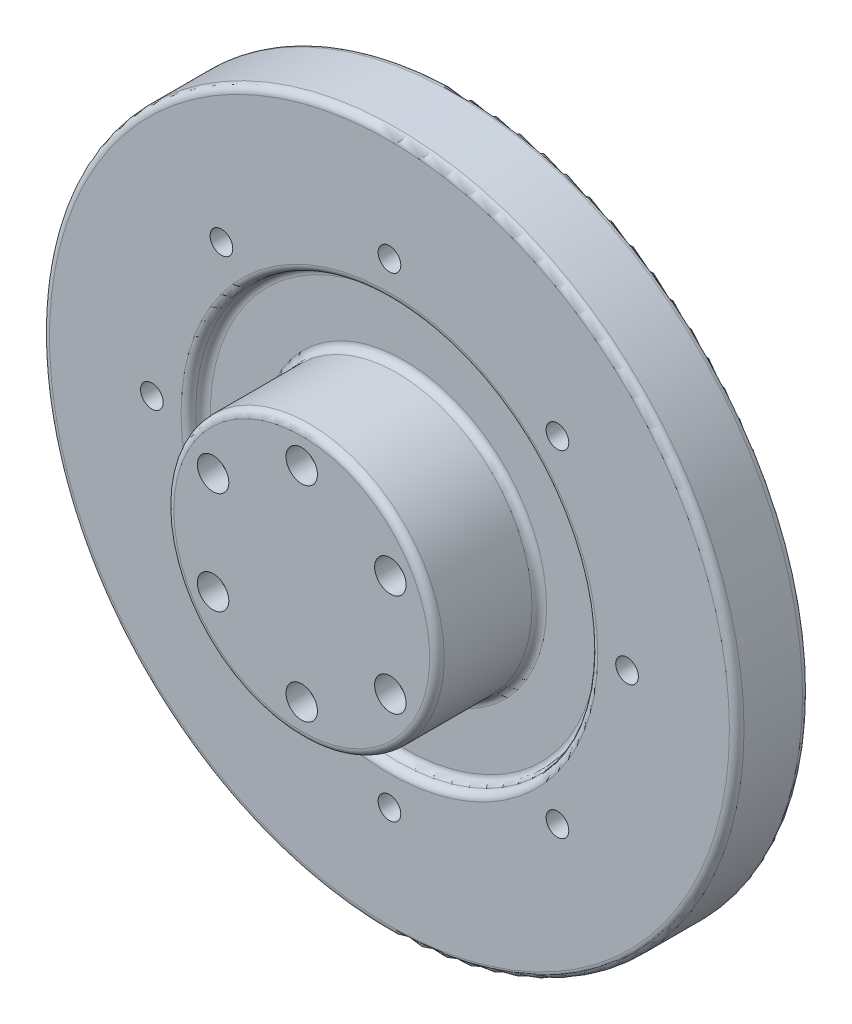
ISO-10303-21;
HEADER;
FILE_DESCRIPTION(('STEP AP214'),'2;1');
FILE_NAME('part.step','',(''),(''),'','','');
FILE_SCHEMA(('AUTOMOTIVE_DESIGN { 1 0 10303 214 1 1 1 1 }'));
ENDSEC;
DATA;
#1=APPLICATION_CONTEXT('core data for automotive mechanical design processes');
#2=APPLICATION_PROTOCOL_DEFINITION('international standard','automotive_design',2000,#1);
#3=PRODUCT_CONTEXT('',#1,'mechanical');
#4=PRODUCT('Part','Part','',(#3));
#5=PRODUCT_RELATED_PRODUCT_CATEGORY('part','',(#4));
#6=PRODUCT_DEFINITION_FORMATION('','',#4);
#7=PRODUCT_DEFINITION_CONTEXT('part definition',#1,'design');
#8=PRODUCT_DEFINITION('design','',#6,#7);
#9=PRODUCT_DEFINITION_SHAPE('','',#8);
#10=(LENGTH_UNIT() NAMED_UNIT(*) SI_UNIT(.MILLI.,.METRE.));
#11=(NAMED_UNIT(*) PLANE_ANGLE_UNIT() SI_UNIT($,.RADIAN.));
#12=(NAMED_UNIT(*) SI_UNIT($,.STERADIAN.) SOLID_ANGLE_UNIT());
#13=UNCERTAINTY_MEASURE_WITH_UNIT(LENGTH_MEASURE(1.E-05),#10,'distance_accuracy_value','');
#14=(GEOMETRIC_REPRESENTATION_CONTEXT(3) GLOBAL_UNCERTAINTY_ASSIGNED_CONTEXT((#13)) GLOBAL_UNIT_ASSIGNED_CONTEXT((#10,
#11,#12)) REPRESENTATION_CONTEXT('',''));
#15=CARTESIAN_POINT('',(0.,0.,0.));
#16=DIRECTION('',(0.,0.,1.));
#17=DIRECTION('',(1.,0.,0.));
#18=AXIS2_PLACEMENT_3D('',#15,#16,#17);
#19=CARTESIAN_POINT('',(0.,0.,10.));
#20=DIRECTION('',(0.,0.,-1.));
#21=DIRECTION('',(-1.,0.,0.));
#22=AXIS2_PLACEMENT_3D('',#19,#20,#21);
#23=CYLINDRICAL_SURFACE('',#22,47.5);
#24=CARTESIAN_POINT('',(0.,0.,0.999999999999999));
#25=DIRECTION('',(0.,0.,1.));
#26=DIRECTION('',(1.,0.,0.));
#27=AXIS2_PLACEMENT_3D('',#24,#25,#26);
#28=CIRCLE('',#27,47.5);
#29=CARTESIAN_POINT('',(47.5,0.,0.999999999999999));
#30=VERTEX_POINT('',#29);
#31=EDGE_CURVE('E66',#30,#30,#28,.T.);
#32=ORIENTED_EDGE('',*,*,#31,.T.);
#33=EDGE_LOOP('',(#32));
#34=FACE_BOUND('',#33,.T.);
#35=CARTESIAN_POINT('',(0.,0.,9.));
#36=DIRECTION('',(0.,0.,1.));
#37=DIRECTION('',(1.,0.,0.));
#38=AXIS2_PLACEMENT_3D('',#35,#36,#37);
#39=CIRCLE('',#38,47.5);
#40=CARTESIAN_POINT('',(47.5,0.,9.));
#41=VERTEX_POINT('',#40);
#42=EDGE_CURVE('E69',#41,#41,#39,.F.);
#43=ORIENTED_EDGE('',*,*,#42,.T.);
#44=EDGE_LOOP('',(#43));
#45=FACE_BOUND('',#44,.T.);
#46=ADVANCED_FACE('F39',(#34,#45),#23,.T.);
#47=CARTESIAN_POINT('',(0.,0.,10.));
#48=DIRECTION('',(0.,0.,1.));
#49=DIRECTION('',(1.,0.,0.));
#50=AXIS2_PLACEMENT_3D('',#47,#48,#49);
#51=PLANE('',#50);
#52=CARTESIAN_POINT('',(0.,0.,10.));
#53=DIRECTION('',(0.,0.,1.));
#54=DIRECTION('',(1.,0.,0.));
#55=AXIS2_PLACEMENT_3D('',#52,#53,#54);
#56=CIRCLE('',#55,28.5);
#57=CARTESIAN_POINT('',(28.5,0.,10.));
#58=VERTEX_POINT('',#57);
#59=EDGE_CURVE('E87',#58,#58,#56,.F.);
#60=ORIENTED_EDGE('',*,*,#59,.T.);
#61=EDGE_LOOP('',(#60));
#62=FACE_BOUND('',#61,.T.);
#63=CARTESIAN_POINT('',(0.,0.,10.));
#64=DIRECTION('',(0.,0.,1.));
#65=DIRECTION('',(1.,0.,0.));
#66=AXIS2_PLACEMENT_3D('',#63,#64,#65);
#67=CIRCLE('',#66,46.5);
#68=CARTESIAN_POINT('',(46.5,0.,10.));
#69=VERTEX_POINT('',#68);
#70=EDGE_CURVE('E90',#69,#69,#67,.T.);
#71=ORIENTED_EDGE('',*,*,#70,.T.);
#72=EDGE_LOOP('',(#71));
#73=FACE_BOUND('',#72,.T.);
#74=CARTESIAN_POINT('',(-32.5,-1.13473143512402E-13,10.));
#75=DIRECTION('',(0.,0.,-1.));
#76=DIRECTION('',(0.,-1.,0.));
#77=AXIS2_PLACEMENT_3D('',#74,#75,#76);
#78=CIRCLE('',#77,1.55);
#79=CARTESIAN_POINT('',(-32.5,-1.55000000000011,10.));
#80=VERTEX_POINT('',#79);
#81=EDGE_CURVE('E161',#80,#80,#78,.T.);
#82=ORIENTED_EDGE('',*,*,#81,.T.);
#83=EDGE_LOOP('',(#82));
#84=FACE_BOUND('',#83,.T.);
#85=CARTESIAN_POINT('',(-22.9809703885627,-22.9809703885629,10.));
#86=DIRECTION('',(0.,0.,-1.));
#87=DIRECTION('',(0.707106781186551,-0.707106781186544,0.));
#88=AXIS2_PLACEMENT_3D('',#85,#86,#87);
#89=CIRCLE('',#88,1.55);
#90=CARTESIAN_POINT('',(-21.8849548777235,-24.0769858994021,10.));
#91=VERTEX_POINT('',#90);
#92=EDGE_CURVE('E155',#91,#91,#89,.T.);
#93=ORIENTED_EDGE('',*,*,#92,.T.);
#94=EDGE_LOOP('',(#93));
#95=FACE_BOUND('',#94,.T.);
#96=CARTESIAN_POINT('',(0.,-32.5,10.));
#97=DIRECTION('',(0.,0.,-1.));
#98=DIRECTION('',(1.,0.,0.));
#99=AXIS2_PLACEMENT_3D('',#96,#97,#98);
#100=CIRCLE('',#99,1.55);
#101=CARTESIAN_POINT('',(1.55,-32.5,10.));
#102=VERTEX_POINT('',#101);
#103=EDGE_CURVE('E149',#102,#102,#100,.T.);
#104=ORIENTED_EDGE('',*,*,#103,.T.);
#105=EDGE_LOOP('',(#104));
#106=FACE_BOUND('',#105,.T.);
#107=CARTESIAN_POINT('',(22.980970388563,-22.9809703885626,10.));
#108=DIRECTION('',(0.,0.,-1.));
#109=DIRECTION('',(0.707106781186541,0.707106781186554,0.));
#110=AXIS2_PLACEMENT_3D('',#107,#108,#109);
#111=CIRCLE('',#110,1.55);
#112=CARTESIAN_POINT('',(24.0769858994021,-21.8849548777234,10.));
#113=VERTEX_POINT('',#112);
#114=EDGE_CURVE('E142',#113,#113,#111,.T.);
#115=ORIENTED_EDGE('',*,*,#114,.T.);
#116=EDGE_LOOP('',(#115));
#117=FACE_BOUND('',#116,.T.);
#118=CARTESIAN_POINT('',(32.5,3.40419430537206E-13,10.));
#119=DIRECTION('',(0.,0.,-1.));
#120=DIRECTION('',(0.,1.,0.));
#121=AXIS2_PLACEMENT_3D('',#118,#119,#120);
#122=CIRCLE('',#121,1.55);
#123=CARTESIAN_POINT('',(32.5,1.55000000000034,10.));
#124=VERTEX_POINT('',#123);
#125=EDGE_CURVE('E173',#124,#124,#122,.T.);
#126=ORIENTED_EDGE('',*,*,#125,.T.);
#127=EDGE_LOOP('',(#126));
#128=FACE_BOUND('',#127,.T.);
#129=CARTESIAN_POINT('',(22.9809703885625,22.9809703885631,10.));
#130=DIRECTION('',(0.,0.,-1.));
#131=DIRECTION('',(-0.707106781186556,0.707106781186539,0.));
#132=AXIS2_PLACEMENT_3D('',#129,#130,#131);
#133=CIRCLE('',#132,1.55);
#134=CARTESIAN_POINT('',(21.8849548777234,24.0769858994022,10.));
#135=VERTEX_POINT('',#134);
#136=EDGE_CURVE('E166',#135,#135,#133,.T.);
#137=ORIENTED_EDGE('',*,*,#136,.T.);
#138=EDGE_LOOP('',(#137));
#139=FACE_BOUND('',#138,.T.);
#140=CARTESIAN_POINT('',(-22.9809703885628,22.9809703885628,10.));
#141=DIRECTION('',(0.,0.,-1.));
#142=DIRECTION('',(-0.707106781186546,-0.707106781186549,0.));
#143=AXIS2_PLACEMENT_3D('',#140,#141,#142);
#144=CIRCLE('',#143,1.55);
#145=CARTESIAN_POINT('',(-24.076985899402,21.8849548777236,10.));
#146=VERTEX_POINT('',#145);
#147=EDGE_CURVE('E136',#146,#146,#144,.T.);
#148=ORIENTED_EDGE('',*,*,#147,.T.);
#149=EDGE_LOOP('',(#148));
#150=FACE_BOUND('',#149,.T.);
#151=CARTESIAN_POINT('',(0.,32.5,10.));
#152=DIRECTION('',(0.,0.,-1.));
#153=DIRECTION('',(-1.,0.,0.));
#154=AXIS2_PLACEMENT_3D('',#151,#152,#153);
#155=CIRCLE('',#154,1.55);
#156=CARTESIAN_POINT('',(-1.55,32.5,10.));
#157=VERTEX_POINT('',#156);
#158=EDGE_CURVE('E130',#157,#157,#155,.T.);
#159=ORIENTED_EDGE('',*,*,#158,.T.);
#160=EDGE_LOOP('',(#159));
#161=FACE_BOUND('',#160,.T.);
#162=ADVANCED_FACE('F226',(#62,#73,#84,#95,#106,#117,#128,#139,#150,#161),#51,.T.);
#163=CARTESIAN_POINT('',(0.,0.,0.));
#164=DIRECTION('',(0.,0.,1.));
#165=DIRECTION('',(1.,0.,0.));
#166=AXIS2_PLACEMENT_3D('',#163,#164,#165);
#167=PLANE('',#166);
#168=CARTESIAN_POINT('',(0.,0.,0.));
#169=DIRECTION('',(0.,0.,1.));
#170=DIRECTION('',(1.,0.,0.));
#171=AXIS2_PLACEMENT_3D('',#168,#169,#170);
#172=CIRCLE('',#171,18.5);
#173=CARTESIAN_POINT('',(18.5,0.,0.));
#174=VERTEX_POINT('',#173);
#175=EDGE_CURVE('E72',#174,#174,#172,.T.);
#176=ORIENTED_EDGE('',*,*,#175,.T.);
#177=EDGE_LOOP('',(#176));
#178=FACE_BOUND('',#177,.T.);
#179=CARTESIAN_POINT('',(0.,0.,0.));
#180=DIRECTION('',(0.,0.,1.));
#181=DIRECTION('',(1.,0.,0.));
#182=AXIS2_PLACEMENT_3D('',#179,#180,#181);
#183=CIRCLE('',#182,46.5);
#184=CARTESIAN_POINT('',(46.5,0.,0.));
#185=VERTEX_POINT('',#184);
#186=EDGE_CURVE('E75',#185,#185,#183,.F.);
#187=ORIENTED_EDGE('',*,*,#186,.T.);
#188=EDGE_LOOP('',(#187));
#189=FACE_BOUND('',#188,.T.);
#190=CARTESIAN_POINT('',(22.9496732002875,13.2500000000003,0.));
#191=DIRECTION('',(0.,0.,-1.));
#192=DIRECTION('',(-0.50000000000001,0.866025403784433,0.));
#193=AXIS2_PLACEMENT_3D('',#190,#191,#192);
#194=CIRCLE('',#193,2.975);
#195=CARTESIAN_POINT('',(21.4621732002874,15.826425576259,0.));
#196=VERTEX_POINT('',#195);
#197=EDGE_CURVE('E59',#196,#196,#194,.T.);
#198=ORIENTED_EDGE('',*,*,#197,.F.);
#199=EDGE_LOOP('',(#198));
#200=FACE_BOUND('',#199,.T.);
#201=CARTESIAN_POINT('',(22.9496732002877,-13.2499999999998,0.));
#202=DIRECTION('',(0.,0.,-1.));
#203=DIRECTION('',(0.499999999999992,0.866025403784443,0.));
#204=AXIS2_PLACEMENT_3D('',#201,#202,#203);
#205=CIRCLE('',#204,2.975);
#206=CARTESIAN_POINT('',(24.4371732002877,-10.6735744237411,0.));
#207=VERTEX_POINT('',#206);
#208=EDGE_CURVE('E195',#207,#207,#205,.T.);
#209=ORIENTED_EDGE('',*,*,#208,.F.);
#210=EDGE_LOOP('',(#209));
#211=FACE_BOUND('',#210,.T.);
#212=CARTESIAN_POINT('',(0.,-26.5,0.));
#213=DIRECTION('',(0.,0.,-1.));
#214=DIRECTION('',(1.,0.,0.));
#215=AXIS2_PLACEMENT_3D('',#212,#213,#214);
#216=CIRCLE('',#215,2.975);
#217=CARTESIAN_POINT('',(2.975,-26.5,0.));
#218=VERTEX_POINT('',#217);
#219=EDGE_CURVE('E201',#218,#218,#216,.T.);
#220=ORIENTED_EDGE('',*,*,#219,.F.);
#221=EDGE_LOOP('',(#220));
#222=FACE_BOUND('',#221,.T.);
#223=CARTESIAN_POINT('',(-22.9496732002876,-13.2500000000001,0.));
#224=DIRECTION('',(0.,0.,-1.));
#225=DIRECTION('',(0.500000000000004,-0.866025403784436,0.));
#226=AXIS2_PLACEMENT_3D('',#223,#224,#225);
#227=CIRCLE('',#226,2.975);
#228=CARTESIAN_POINT('',(-21.4621732002876,-15.8264255762588,0.));
#229=VERTEX_POINT('',#228);
#230=EDGE_CURVE('E207',#229,#229,#227,.T.);
#231=ORIENTED_EDGE('',*,*,#230,.F.);
#232=EDGE_LOOP('',(#231));
#233=FACE_BOUND('',#232,.T.);
#234=CARTESIAN_POINT('',(-22.9496732002877,13.2499999999999,0.));
#235=DIRECTION('',(0.,0.,-1.));
#236=DIRECTION('',(-0.499999999999998,-0.86602540378444,0.));
#237=AXIS2_PLACEMENT_3D('',#234,#235,#236);
#238=CIRCLE('',#237,2.975);
#239=CARTESIAN_POINT('',(-24.4371732002876,10.6735744237412,0.));
#240=VERTEX_POINT('',#239);
#241=EDGE_CURVE('E184',#240,#240,#238,.T.);
#242=ORIENTED_EDGE('',*,*,#241,.F.);
#243=EDGE_LOOP('',(#242));
#244=FACE_BOUND('',#243,.T.);
#245=CARTESIAN_POINT('',(0.,26.5,0.));
#246=DIRECTION('',(0.,0.,-1.));
#247=DIRECTION('',(-1.,0.,0.));
#248=AXIS2_PLACEMENT_3D('',#245,#246,#247);
#249=CIRCLE('',#248,2.975);
#250=CARTESIAN_POINT('',(-2.975,26.5,0.));
#251=VERTEX_POINT('',#250);
#252=EDGE_CURVE('E178',#251,#251,#249,.T.);
#253=ORIENTED_EDGE('',*,*,#252,.F.);
#254=EDGE_LOOP('',(#253));
#255=FACE_BOUND('',#254,.T.);
#256=ADVANCED_FACE('F222',(#178,#189,#200,#211,#222,#233,#244,#255),#167,.F.);
#257=CARTESIAN_POINT('',(0.,0.,22.));
#258=DIRECTION('',(0.,0.,-1.));
#259=DIRECTION('',(-1.,0.,0.));
#260=AXIS2_PLACEMENT_3D('',#257,#258,#259);
#261=PLANE('',#260);
#262=CARTESIAN_POINT('',(0.,0.,22.));
#263=DIRECTION('',(0.,0.,-1.));
#264=DIRECTION('',(-1.,0.,0.));
#265=AXIS2_PLACEMENT_3D('',#262,#263,#264);
#266=CIRCLE('',#265,17.5);
#267=CARTESIAN_POINT('',(-17.5,0.,22.));
#268=VERTEX_POINT('',#267);
#269=EDGE_CURVE('E50',#268,#268,#266,.F.);
#270=ORIENTED_EDGE('',*,*,#269,.T.);
#271=EDGE_LOOP('',(#270));
#272=FACE_BOUND('',#271,.T.);
#273=CARTESIAN_POINT('',(-12.1243556529821,7.00000000000014,22.));
#274=DIRECTION('',(0.,0.,-1.));
#275=DIRECTION('',(-1.,0.,0.));
#276=AXIS2_PLACEMENT_3D('',#273,#274,#275);
#277=CIRCLE('',#276,2.15);
#278=CARTESIAN_POINT('',(-14.2743556529821,7.00000000000014,22.));
#279=VERTEX_POINT('',#278);
#280=EDGE_CURVE('E99',#279,#279,#277,.T.);
#281=ORIENTED_EDGE('',*,*,#280,.T.);
#282=EDGE_LOOP('',(#281));
#283=FACE_BOUND('',#282,.T.);
#284=CARTESIAN_POINT('',(-12.1243556529822,-6.99999999999989,22.));
#285=DIRECTION('',(0.,0.,-1.));
#286=DIRECTION('',(-1.,0.,0.));
#287=AXIS2_PLACEMENT_3D('',#284,#285,#286);
#288=CIRCLE('',#287,2.15);
#289=CARTESIAN_POINT('',(-14.2743556529822,-6.99999999999989,22.));
#290=VERTEX_POINT('',#289);
#291=EDGE_CURVE('E102',#290,#290,#288,.T.);
#292=ORIENTED_EDGE('',*,*,#291,.T.);
#293=EDGE_LOOP('',(#292));
#294=FACE_BOUND('',#293,.T.);
#295=CARTESIAN_POINT('',(0.,-14.,22.));
#296=DIRECTION('',(0.,0.,-1.));
#297=DIRECTION('',(-1.,0.,0.));
#298=AXIS2_PLACEMENT_3D('',#295,#296,#297);
#299=CIRCLE('',#298,2.15);
#300=CARTESIAN_POINT('',(-2.15,-14.,22.));
#301=VERTEX_POINT('',#300);
#302=EDGE_CURVE('E105',#301,#301,#299,.T.);
#303=ORIENTED_EDGE('',*,*,#302,.T.);
#304=EDGE_LOOP('',(#303));
#305=FACE_BOUND('',#304,.T.);
#306=CARTESIAN_POINT('',(12.1243556529821,-7.00000000000006,22.));
#307=DIRECTION('',(0.,0.,-1.));
#308=DIRECTION('',(-1.,0.,0.));
#309=AXIS2_PLACEMENT_3D('',#306,#307,#308);
#310=CIRCLE('',#309,2.15);
#311=CARTESIAN_POINT('',(9.97435565298211,-7.00000000000006,22.));
#312=VERTEX_POINT('',#311);
#313=EDGE_CURVE('E108',#312,#312,#310,.T.);
#314=ORIENTED_EDGE('',*,*,#313,.T.);
#315=EDGE_LOOP('',(#314));
#316=FACE_BOUND('',#315,.T.);
#317=CARTESIAN_POINT('',(12.1243556529822,6.99999999999997,22.));
#318=DIRECTION('',(0.,0.,-1.));
#319=DIRECTION('',(-1.,0.,0.));
#320=AXIS2_PLACEMENT_3D('',#317,#318,#319);
#321=CIRCLE('',#320,2.15);
#322=CARTESIAN_POINT('',(9.97435565298216,6.99999999999997,22.));
#323=VERTEX_POINT('',#322);
#324=EDGE_CURVE('E111',#323,#323,#321,.T.);
#325=ORIENTED_EDGE('',*,*,#324,.T.);
#326=EDGE_LOOP('',(#325));
#327=FACE_BOUND('',#326,.T.);
#328=CARTESIAN_POINT('',(0.,14.,22.));
#329=DIRECTION('',(0.,0.,-1.));
#330=DIRECTION('',(-1.,0.,0.));
#331=AXIS2_PLACEMENT_3D('',#328,#329,#330);
#332=CIRCLE('',#331,2.15);
#333=CARTESIAN_POINT('',(-2.15,14.,22.));
#334=VERTEX_POINT('',#333);
#335=EDGE_CURVE('E93',#334,#334,#332,.T.);
#336=ORIENTED_EDGE('',*,*,#335,.T.);
#337=EDGE_LOOP('',(#336));
#338=FACE_BOUND('',#337,.T.);
#339=ADVANCED_FACE('F225',(#272,#283,#294,#305,#316,#327,#338),#261,.F.);
#340=CARTESIAN_POINT('',(0.,0.,0.));
#341=DIRECTION('',(0.,0.,-1.));
#342=DIRECTION('',(-1.,0.,0.));
#343=AXIS2_PLACEMENT_3D('',#340,#341,#342);
#344=CYLINDRICAL_SURFACE('',#343,18.5);
#345=CARTESIAN_POINT('',(0.,0.,9.));
#346=DIRECTION('',(0.,0.,1.));
#347=DIRECTION('',(1.,0.,0.));
#348=AXIS2_PLACEMENT_3D('',#345,#346,#347);
#349=CIRCLE('',#348,18.5);
#350=CARTESIAN_POINT('',(18.5,0.,9.));
#351=VERTEX_POINT('',#350);
#352=EDGE_CURVE('E54',#351,#351,#349,.T.);
#353=ORIENTED_EDGE('',*,*,#352,.T.);
#354=EDGE_LOOP('',(#353));
#355=FACE_BOUND('',#354,.T.);
#356=CARTESIAN_POINT('',(0.,0.,21.));
#357=DIRECTION('',(0.,0.,-1.));
#358=DIRECTION('',(-1.,0.,0.));
#359=AXIS2_PLACEMENT_3D('',#356,#357,#358);
#360=CIRCLE('',#359,18.5);
#361=CARTESIAN_POINT('',(-18.5,0.,21.));
#362=VERTEX_POINT('',#361);
#363=EDGE_CURVE('E63',#362,#362,#360,.T.);
#364=ORIENTED_EDGE('',*,*,#363,.T.);
#365=EDGE_LOOP('',(#364));
#366=FACE_BOUND('',#365,.T.);
#367=ADVANCED_FACE('F298',(#355,#366),#344,.T.);
#368=CARTESIAN_POINT('',(0.,0.,19.));
#369=DIRECTION('',(0.,0.,-1.));
#370=DIRECTION('',(-1.,0.,0.));
#371=AXIS2_PLACEMENT_3D('',#368,#369,#370);
#372=CYLINDRICAL_SURFACE('',#371,17.5);
#373=CARTESIAN_POINT('',(0.,0.,18.5));
#374=DIRECTION('',(0.,0.,-1.));
#375=DIRECTION('',(-1.,0.,0.));
#376=AXIS2_PLACEMENT_3D('',#373,#374,#375);
#377=CIRCLE('',#376,17.5);
#378=CARTESIAN_POINT('',(-17.5,0.,18.5));
#379=VERTEX_POINT('',#378);
#380=EDGE_CURVE('E10',#379,#379,#377,.F.);
#381=ORIENTED_EDGE('',*,*,#380,.T.);
#382=EDGE_LOOP('',(#381));
#383=FACE_BOUND('',#382,.T.);
#384=CARTESIAN_POINT('',(0.,0.,1.));
#385=DIRECTION('',(0.,0.,1.));
#386=DIRECTION('',(1.,0.,0.));
#387=AXIS2_PLACEMENT_3D('',#384,#385,#386);
#388=CIRCLE('',#387,17.5);
#389=CARTESIAN_POINT('',(17.5,0.,1.));
#390=VERTEX_POINT('',#389);
#391=EDGE_CURVE('E78',#390,#390,#388,.F.);
#392=ORIENTED_EDGE('',*,*,#391,.T.);
#393=EDGE_LOOP('',(#392));
#394=FACE_BOUND('',#393,.T.);
#395=ADVANCED_FACE('F300',(#383,#394),#372,.F.);
#396=CARTESIAN_POINT('',(0.,0.,19.));
#397=DIRECTION('',(0.,0.,-1.));
#398=DIRECTION('',(-1.,0.,0.));
#399=AXIS2_PLACEMENT_3D('',#396,#397,#398);
#400=PLANE('',#399);
#401=CARTESIAN_POINT('',(0.,0.,19.));
#402=DIRECTION('',(0.,0.,-1.));
#403=DIRECTION('',(-1.,0.,0.));
#404=AXIS2_PLACEMENT_3D('',#401,#402,#403);
#405=CIRCLE('',#404,17.);
#406=CARTESIAN_POINT('',(-17.,0.,19.));
#407=VERTEX_POINT('',#406);
#408=EDGE_CURVE('E46',#407,#407,#405,.T.);
#409=ORIENTED_EDGE('',*,*,#408,.T.);
#410=EDGE_LOOP('',(#409));
#411=FACE_BOUND('',#410,.T.);
#412=CARTESIAN_POINT('',(-12.1243556529821,7.00000000000014,19.));
#413=DIRECTION('',(0.,0.,-1.));
#414=DIRECTION('',(-0.50000000000001,-0.866025403784433,0.));
#415=AXIS2_PLACEMENT_3D('',#412,#413,#414);
#416=CIRCLE('',#415,2.15);
#417=CARTESIAN_POINT('',(-13.1993556529821,5.13804538186361,19.));
#418=VERTEX_POINT('',#417);
#419=EDGE_CURVE('E118',#418,#418,#416,.T.);
#420=ORIENTED_EDGE('',*,*,#419,.F.);
#421=EDGE_LOOP('',(#420));
#422=FACE_BOUND('',#421,.T.);
#423=CARTESIAN_POINT('',(-12.1243556529822,-6.99999999999989,19.));
#424=DIRECTION('',(0.,0.,-1.));
#425=DIRECTION('',(0.499999999999992,-0.866025403784443,0.));
#426=AXIS2_PLACEMENT_3D('',#423,#424,#425);
#427=CIRCLE('',#426,2.15);
#428=CARTESIAN_POINT('',(-11.0493556529822,-8.86195461813644,19.));
#429=VERTEX_POINT('',#428);
#430=EDGE_CURVE('E121',#429,#429,#427,.T.);
#431=ORIENTED_EDGE('',*,*,#430,.F.);
#432=EDGE_LOOP('',(#431));
#433=FACE_BOUND('',#432,.T.);
#434=CARTESIAN_POINT('',(0.,-14.,19.));
#435=DIRECTION('',(0.,0.,-1.));
#436=DIRECTION('',(1.,0.,0.));
#437=AXIS2_PLACEMENT_3D('',#434,#435,#436);
#438=CIRCLE('',#437,2.15);
#439=CARTESIAN_POINT('',(2.15,-14.,19.));
#440=VERTEX_POINT('',#439);
#441=EDGE_CURVE('E125',#440,#440,#438,.T.);
#442=ORIENTED_EDGE('',*,*,#441,.F.);
#443=EDGE_LOOP('',(#442));
#444=FACE_BOUND('',#443,.T.);
#445=CARTESIAN_POINT('',(12.1243556529821,-7.00000000000006,19.));
#446=DIRECTION('',(0.,0.,-1.));
#447=DIRECTION('',(0.500000000000004,0.866025403784436,0.));
#448=AXIS2_PLACEMENT_3D('',#445,#446,#447);
#449=CIRCLE('',#448,2.15);
#450=CARTESIAN_POINT('',(13.1993556529821,-5.13804538186352,19.));
#451=VERTEX_POINT('',#450);
#452=EDGE_CURVE('E117',#451,#451,#449,.T.);
#453=ORIENTED_EDGE('',*,*,#452,.F.);
#454=EDGE_LOOP('',(#453));
#455=FACE_BOUND('',#454,.T.);
#456=CARTESIAN_POINT('',(12.1243556529822,6.99999999999997,19.));
#457=DIRECTION('',(0.,0.,-1.));
#458=DIRECTION('',(-0.499999999999998,0.86602540378444,0.));
#459=AXIS2_PLACEMENT_3D('',#456,#457,#458);
#460=CIRCLE('',#459,2.15);
#461=CARTESIAN_POINT('',(11.0493556529822,8.86195461813652,19.));
#462=VERTEX_POINT('',#461);
#463=EDGE_CURVE('E114',#462,#462,#460,.T.);
#464=ORIENTED_EDGE('',*,*,#463,.F.);
#465=EDGE_LOOP('',(#464));
#466=FACE_BOUND('',#465,.T.);
#467=CARTESIAN_POINT('',(0.,14.,19.));
#468=DIRECTION('',(0.,0.,-1.));
#469=DIRECTION('',(-1.,0.,0.));
#470=AXIS2_PLACEMENT_3D('',#467,#468,#469);
#471=CIRCLE('',#470,2.15);
#472=CARTESIAN_POINT('',(-2.15,14.,19.));
#473=VERTEX_POINT('',#472);
#474=EDGE_CURVE('E96',#473,#473,#471,.T.);
#475=ORIENTED_EDGE('',*,*,#474,.F.);
#476=EDGE_LOOP('',(#475));
#477=FACE_BOUND('',#476,.T.);
#478=ADVANCED_FACE('F306',(#411,#422,#433,#444,#455,#466,#477),#400,.T.);
#479=CARTESIAN_POINT('',(0.,14.,29.));
#480=DIRECTION('',(0.,0.,-1.));
#481=DIRECTION('',(-1.,0.,0.));
#482=AXIS2_PLACEMENT_3D('',#479,#480,#481);
#483=CYLINDRICAL_SURFACE('',#482,2.15);
#484=ORIENTED_EDGE('',*,*,#474,.T.);
#485=EDGE_LOOP('',(#484));
#486=FACE_BOUND('',#485,.T.);
#487=ORIENTED_EDGE('',*,*,#335,.F.);
#488=EDGE_LOOP('',(#487));
#489=FACE_BOUND('',#488,.T.);
#490=ADVANCED_FACE('F313',(#486,#489),#483,.F.);
#491=CARTESIAN_POINT('',(12.1243556529822,6.99999999999997,29.));
#492=DIRECTION('',(0.,0.,-1.));
#493=DIRECTION('',(-1.,0.,0.));
#494=AXIS2_PLACEMENT_3D('',#491,#492,#493);
#495=CYLINDRICAL_SURFACE('',#494,2.15);
#496=ORIENTED_EDGE('',*,*,#463,.T.);
#497=EDGE_LOOP('',(#496));
#498=FACE_BOUND('',#497,.T.);
#499=ORIENTED_EDGE('',*,*,#324,.F.);
#500=EDGE_LOOP('',(#499));
#501=FACE_BOUND('',#500,.T.);
#502=ADVANCED_FACE('F316',(#498,#501),#495,.F.);
#503=CARTESIAN_POINT('',(12.1243556529821,-7.00000000000006,29.));
#504=DIRECTION('',(0.,0.,-1.));
#505=DIRECTION('',(-1.,0.,0.));
#506=AXIS2_PLACEMENT_3D('',#503,#504,#505);
#507=CYLINDRICAL_SURFACE('',#506,2.15);
#508=ORIENTED_EDGE('',*,*,#452,.T.);
#509=EDGE_LOOP('',(#508));
#510=FACE_BOUND('',#509,.T.);
#511=ORIENTED_EDGE('',*,*,#313,.F.);
#512=EDGE_LOOP('',(#511));
#513=FACE_BOUND('',#512,.T.);
#514=ADVANCED_FACE('F320',(#510,#513),#507,.F.);
#515=CARTESIAN_POINT('',(0.,-14.,29.));
#516=DIRECTION('',(0.,0.,-1.));
#517=DIRECTION('',(-1.,0.,0.));
#518=AXIS2_PLACEMENT_3D('',#515,#516,#517);
#519=CYLINDRICAL_SURFACE('',#518,2.15);
#520=ORIENTED_EDGE('',*,*,#441,.T.);
#521=EDGE_LOOP('',(#520));
#522=FACE_BOUND('',#521,.T.);
#523=ORIENTED_EDGE('',*,*,#302,.F.);
#524=EDGE_LOOP('',(#523));
#525=FACE_BOUND('',#524,.T.);
#526=ADVANCED_FACE('F330',(#522,#525),#519,.F.);
#527=CARTESIAN_POINT('',(-12.1243556529822,-6.99999999999989,29.));
#528=DIRECTION('',(0.,0.,-1.));
#529=DIRECTION('',(-1.,0.,0.));
#530=AXIS2_PLACEMENT_3D('',#527,#528,#529);
#531=CYLINDRICAL_SURFACE('',#530,2.15);
#532=ORIENTED_EDGE('',*,*,#430,.T.);
#533=EDGE_LOOP('',(#532));
#534=FACE_BOUND('',#533,.T.);
#535=ORIENTED_EDGE('',*,*,#291,.F.);
#536=EDGE_LOOP('',(#535));
#537=FACE_BOUND('',#536,.T.);
#538=ADVANCED_FACE('F326',(#534,#537),#531,.F.);
#539=CARTESIAN_POINT('',(-12.1243556529821,7.00000000000014,29.));
#540=DIRECTION('',(0.,0.,-1.));
#541=DIRECTION('',(-1.,0.,0.));
#542=AXIS2_PLACEMENT_3D('',#539,#540,#541);
#543=CYLINDRICAL_SURFACE('',#542,2.15);
#544=ORIENTED_EDGE('',*,*,#419,.T.);
#545=EDGE_LOOP('',(#544));
#546=FACE_BOUND('',#545,.T.);
#547=ORIENTED_EDGE('',*,*,#280,.F.);
#548=EDGE_LOOP('',(#547));
#549=FACE_BOUND('',#548,.T.);
#550=ADVANCED_FACE('F322',(#546,#549),#543,.F.);
#551=CARTESIAN_POINT('',(0.,32.5,5.3));
#552=DIRECTION('',(0.,0.,1.));
#553=DIRECTION('',(1.,0.,0.));
#554=AXIS2_PLACEMENT_3D('',#551,#552,#553);
#555=CYLINDRICAL_SURFACE('',#554,1.55);
#556=CARTESIAN_POINT('',(0.,32.5,5.3));
#557=DIRECTION('',(0.,0.,-1.));
#558=DIRECTION('',(-1.,0.,0.));
#559=AXIS2_PLACEMENT_3D('',#556,#557,#558);
#560=CIRCLE('',#559,1.55);
#561=CARTESIAN_POINT('',(-1.55,32.5,5.3));
#562=VERTEX_POINT('',#561);
#563=EDGE_CURVE('E122',#562,#562,#560,.T.);
#564=ORIENTED_EDGE('',*,*,#563,.T.);
#565=EDGE_LOOP('',(#564));
#566=FACE_BOUND('',#565,.T.);
#567=ORIENTED_EDGE('',*,*,#158,.F.);
#568=EDGE_LOOP('',(#567));
#569=FACE_BOUND('',#568,.T.);
#570=ADVANCED_FACE('F325',(#566,#569),#555,.F.);
#571=CARTESIAN_POINT('',(0.,32.5,5.3));
#572=DIRECTION('',(0.,0.,-1.));
#573=DIRECTION('',(-1.,0.,0.));
#574=AXIS2_PLACEMENT_3D('',#571,#572,#573);
#575=PLANE('',#574);
#576=ORIENTED_EDGE('',*,*,#563,.F.);
#577=EDGE_LOOP('',(#576));
#578=FACE_BOUND('',#577,.T.);
#579=ADVANCED_FACE('F340',(#578),#575,.F.);
#580=CARTESIAN_POINT('',(-22.9809703885628,22.9809703885628,5.3));
#581=DIRECTION('',(0.,0.,1.));
#582=DIRECTION('',(1.,0.,0.));
#583=AXIS2_PLACEMENT_3D('',#580,#581,#582);
#584=CYLINDRICAL_SURFACE('',#583,1.55);
#585=CARTESIAN_POINT('',(-22.9809703885628,22.9809703885628,5.3));
#586=DIRECTION('',(0.,0.,-1.));
#587=DIRECTION('',(-0.707106781186546,-0.707106781186549,0.));
#588=AXIS2_PLACEMENT_3D('',#585,#586,#587);
#589=CIRCLE('',#588,1.55);
#590=CARTESIAN_POINT('',(-24.076985899402,21.8849548777236,5.3));
#591=VERTEX_POINT('',#590);
#592=EDGE_CURVE('E133',#591,#591,#589,.T.);
#593=ORIENTED_EDGE('',*,*,#592,.T.);
#594=EDGE_LOOP('',(#593));
#595=FACE_BOUND('',#594,.T.);
#596=ORIENTED_EDGE('',*,*,#147,.F.);
#597=EDGE_LOOP('',(#596));
#598=FACE_BOUND('',#597,.T.);
#599=ADVANCED_FACE('F344',(#595,#598),#584,.F.);
#600=CARTESIAN_POINT('',(-22.9809703885628,22.9809703885628,5.3));
#601=DIRECTION('',(0.,0.,-1.));
#602=DIRECTION('',(-0.707106781186546,-0.707106781186549,0.));
#603=AXIS2_PLACEMENT_3D('',#600,#601,#602);
#604=PLANE('',#603);
#605=ORIENTED_EDGE('',*,*,#592,.F.);
#606=EDGE_LOOP('',(#605));
#607=FACE_BOUND('',#606,.T.);
#608=ADVANCED_FACE('F348',(#607),#604,.F.);
#609=CARTESIAN_POINT('',(22.9809703885625,22.9809703885631,5.3));
#610=DIRECTION('',(0.,0.,1.));
#611=DIRECTION('',(1.,0.,0.));
#612=AXIS2_PLACEMENT_3D('',#609,#610,#611);
#613=CYLINDRICAL_SURFACE('',#612,1.55);
#614=CARTESIAN_POINT('',(22.9809703885625,22.9809703885631,5.3));
#615=DIRECTION('',(0.,0.,-1.));
#616=DIRECTION('',(-0.707106781186556,0.707106781186539,0.));
#617=AXIS2_PLACEMENT_3D('',#614,#615,#616);
#618=CIRCLE('',#617,1.55);
#619=CARTESIAN_POINT('',(21.8849548777234,24.0769858994022,5.3));
#620=VERTEX_POINT('',#619);
#621=EDGE_CURVE('E169',#620,#620,#618,.T.);
#622=ORIENTED_EDGE('',*,*,#621,.T.);
#623=EDGE_LOOP('',(#622));
#624=FACE_BOUND('',#623,.T.);
#625=ORIENTED_EDGE('',*,*,#136,.F.);
#626=EDGE_LOOP('',(#625));
#627=FACE_BOUND('',#626,.T.);
#628=ADVANCED_FACE('F352',(#624,#627),#613,.F.);
#629=CARTESIAN_POINT('',(22.9809703885625,22.9809703885631,5.3));
#630=DIRECTION('',(0.,0.,-1.));
#631=DIRECTION('',(-0.707106781186556,0.707106781186539,0.));
#632=AXIS2_PLACEMENT_3D('',#629,#630,#631);
#633=PLANE('',#632);
#634=ORIENTED_EDGE('',*,*,#621,.F.);
#635=EDGE_LOOP('',(#634));
#636=FACE_BOUND('',#635,.T.);
#637=ADVANCED_FACE('F387',(#636),#633,.F.);
#638=CARTESIAN_POINT('',(32.5,3.40419430537206E-13,5.3));
#639=DIRECTION('',(0.,0.,1.));
#640=DIRECTION('',(1.,0.,0.));
#641=AXIS2_PLACEMENT_3D('',#638,#639,#640);
#642=CYLINDRICAL_SURFACE('',#641,1.55);
#643=CARTESIAN_POINT('',(32.5,3.40419430537206E-13,5.3));
#644=DIRECTION('',(0.,0.,-1.));
#645=DIRECTION('',(0.,1.,0.));
#646=AXIS2_PLACEMENT_3D('',#643,#644,#645);
#647=CIRCLE('',#646,1.55);
#648=CARTESIAN_POINT('',(32.5,1.55000000000034,5.3));
#649=VERTEX_POINT('',#648);
#650=EDGE_CURVE('E146',#649,#649,#647,.T.);
#651=ORIENTED_EDGE('',*,*,#650,.T.);
#652=EDGE_LOOP('',(#651));
#653=FACE_BOUND('',#652,.T.);
#654=ORIENTED_EDGE('',*,*,#125,.F.);
#655=EDGE_LOOP('',(#654));
#656=FACE_BOUND('',#655,.T.);
#657=ADVANCED_FACE('F391',(#653,#656),#642,.F.);
#658=CARTESIAN_POINT('',(32.5,3.40419430537206E-13,5.3));
#659=DIRECTION('',(0.,0.,-1.));
#660=DIRECTION('',(0.,1.,0.));
#661=AXIS2_PLACEMENT_3D('',#658,#659,#660);
#662=PLANE('',#661);
#663=ORIENTED_EDGE('',*,*,#650,.F.);
#664=EDGE_LOOP('',(#663));
#665=FACE_BOUND('',#664,.T.);
#666=ADVANCED_FACE('F358',(#665),#662,.F.);
#667=CARTESIAN_POINT('',(22.980970388563,-22.9809703885626,5.3));
#668=DIRECTION('',(0.,0.,1.));
#669=DIRECTION('',(1.,0.,0.));
#670=AXIS2_PLACEMENT_3D('',#667,#668,#669);
#671=CYLINDRICAL_SURFACE('',#670,1.55);
#672=CARTESIAN_POINT('',(22.980970388563,-22.9809703885626,5.3));
#673=DIRECTION('',(0.,0.,-1.));
#674=DIRECTION('',(0.707106781186541,0.707106781186554,0.));
#675=AXIS2_PLACEMENT_3D('',#672,#673,#674);
#676=CIRCLE('',#675,1.55);
#677=CARTESIAN_POINT('',(24.0769858994021,-21.8849548777234,5.3));
#678=VERTEX_POINT('',#677);
#679=EDGE_CURVE('E145',#678,#678,#676,.T.);
#680=ORIENTED_EDGE('',*,*,#679,.T.);
#681=EDGE_LOOP('',(#680));
#682=FACE_BOUND('',#681,.T.);
#683=ORIENTED_EDGE('',*,*,#114,.F.);
#684=EDGE_LOOP('',(#683));
#685=FACE_BOUND('',#684,.T.);
#686=ADVANCED_FACE('F354',(#682,#685),#671,.F.);
#687=CARTESIAN_POINT('',(22.980970388563,-22.9809703885626,5.3));
#688=DIRECTION('',(0.,0.,-1.));
#689=DIRECTION('',(0.707106781186541,0.707106781186554,0.));
#690=AXIS2_PLACEMENT_3D('',#687,#688,#689);
#691=PLANE('',#690);
#692=ORIENTED_EDGE('',*,*,#679,.F.);
#693=EDGE_LOOP('',(#692));
#694=FACE_BOUND('',#693,.T.);
#695=ADVANCED_FACE('F357',(#694),#691,.F.);
#696=CARTESIAN_POINT('',(0.,-32.5,5.3));
#697=DIRECTION('',(0.,0.,1.));
#698=DIRECTION('',(1.,0.,0.));
#699=AXIS2_PLACEMENT_3D('',#696,#697,#698);
#700=CYLINDRICAL_SURFACE('',#699,1.55);
#701=CARTESIAN_POINT('',(0.,-32.5,5.3));
#702=DIRECTION('',(0.,0.,-1.));
#703=DIRECTION('',(1.,0.,0.));
#704=AXIS2_PLACEMENT_3D('',#701,#702,#703);
#705=CIRCLE('',#704,1.55);
#706=CARTESIAN_POINT('',(1.55,-32.5,5.3));
#707=VERTEX_POINT('',#706);
#708=EDGE_CURVE('E152',#707,#707,#705,.T.);
#709=ORIENTED_EDGE('',*,*,#708,.T.);
#710=EDGE_LOOP('',(#709));
#711=FACE_BOUND('',#710,.T.);
#712=ORIENTED_EDGE('',*,*,#103,.F.);
#713=EDGE_LOOP('',(#712));
#714=FACE_BOUND('',#713,.T.);
#715=ADVANCED_FACE('F362',(#711,#714),#700,.F.);
#716=CARTESIAN_POINT('',(0.,-32.5,5.3));
#717=DIRECTION('',(0.,0.,-1.));
#718=DIRECTION('',(1.,0.,0.));
#719=AXIS2_PLACEMENT_3D('',#716,#717,#718);
#720=PLANE('',#719);
#721=ORIENTED_EDGE('',*,*,#708,.F.);
#722=EDGE_LOOP('',(#721));
#723=FACE_BOUND('',#722,.T.);
#724=ADVANCED_FACE('F366',(#723),#720,.F.);
#725=CARTESIAN_POINT('',(-22.9809703885627,-22.9809703885629,5.3));
#726=DIRECTION('',(0.,0.,1.));
#727=DIRECTION('',(1.,0.,0.));
#728=AXIS2_PLACEMENT_3D('',#725,#726,#727);
#729=CYLINDRICAL_SURFACE('',#728,1.55);
#730=CARTESIAN_POINT('',(-22.9809703885627,-22.9809703885629,5.3));
#731=DIRECTION('',(0.,0.,-1.));
#732=DIRECTION('',(0.707106781186551,-0.707106781186544,0.));
#733=AXIS2_PLACEMENT_3D('',#730,#731,#732);
#734=CIRCLE('',#733,1.55);
#735=CARTESIAN_POINT('',(-21.8849548777235,-24.0769858994021,5.3));
#736=VERTEX_POINT('',#735);
#737=EDGE_CURVE('E158',#736,#736,#734,.T.);
#738=ORIENTED_EDGE('',*,*,#737,.T.);
#739=EDGE_LOOP('',(#738));
#740=FACE_BOUND('',#739,.T.);
#741=ORIENTED_EDGE('',*,*,#92,.F.);
#742=EDGE_LOOP('',(#741));
#743=FACE_BOUND('',#742,.T.);
#744=ADVANCED_FACE('F370',(#740,#743),#729,.F.);
#745=CARTESIAN_POINT('',(-22.9809703885627,-22.9809703885629,5.3));
#746=DIRECTION('',(0.,0.,-1.));
#747=DIRECTION('',(0.707106781186551,-0.707106781186544,0.));
#748=AXIS2_PLACEMENT_3D('',#745,#746,#747);
#749=PLANE('',#748);
#750=ORIENTED_EDGE('',*,*,#737,.F.);
#751=EDGE_LOOP('',(#750));
#752=FACE_BOUND('',#751,.T.);
#753=ADVANCED_FACE('F374',(#752),#749,.F.);
#754=CARTESIAN_POINT('',(-32.5,-1.13473143512402E-13,5.3));
#755=DIRECTION('',(0.,0.,1.));
#756=DIRECTION('',(1.,0.,0.));
#757=AXIS2_PLACEMENT_3D('',#754,#755,#756);
#758=CYLINDRICAL_SURFACE('',#757,1.55);
#759=CARTESIAN_POINT('',(-32.5,-1.13473143512402E-13,5.3));
#760=DIRECTION('',(0.,0.,-1.));
#761=DIRECTION('',(0.,-1.,0.));
#762=AXIS2_PLACEMENT_3D('',#759,#760,#761);
#763=CIRCLE('',#762,1.55);
#764=CARTESIAN_POINT('',(-32.5,-1.55000000000011,5.3));
#765=VERTEX_POINT('',#764);
#766=EDGE_CURVE('E139',#765,#765,#763,.T.);
#767=ORIENTED_EDGE('',*,*,#766,.T.);
#768=EDGE_LOOP('',(#767));
#769=FACE_BOUND('',#768,.T.);
#770=ORIENTED_EDGE('',*,*,#81,.F.);
#771=EDGE_LOOP('',(#770));
#772=FACE_BOUND('',#771,.T.);
#773=ADVANCED_FACE('F378',(#769,#772),#758,.F.);
#774=CARTESIAN_POINT('',(-32.5,-1.13473143512402E-13,5.3));
#775=DIRECTION('',(0.,0.,-1.));
#776=DIRECTION('',(0.,-1.,0.));
#777=AXIS2_PLACEMENT_3D('',#774,#775,#776);
#778=PLANE('',#777);
#779=ORIENTED_EDGE('',*,*,#766,.F.);
#780=EDGE_LOOP('',(#779));
#781=FACE_BOUND('',#780,.T.);
#782=ADVANCED_FACE('F247',(#781),#778,.F.);
#783=CARTESIAN_POINT('',(0.,0.,8.));
#784=DIRECTION('',(0.,0.,1.));
#785=DIRECTION('',(1.,0.,0.));
#786=AXIS2_PLACEMENT_3D('',#783,#784,#785);
#787=PLANE('',#786);
#788=CARTESIAN_POINT('',(0.,0.,8.));
#789=DIRECTION('',(0.,0.,1.));
#790=DIRECTION('',(1.,0.,0.));
#791=AXIS2_PLACEMENT_3D('',#788,#789,#790);
#792=CIRCLE('',#791,26.5);
#793=CARTESIAN_POINT('',(26.5,0.,8.));
#794=VERTEX_POINT('',#793);
#795=EDGE_CURVE('E81',#794,#794,#792,.T.);
#796=ORIENTED_EDGE('',*,*,#795,.T.);
#797=EDGE_LOOP('',(#796));
#798=FACE_BOUND('',#797,.T.);
#799=CARTESIAN_POINT('',(0.,0.,8.));
#800=DIRECTION('',(0.,0.,1.));
#801=DIRECTION('',(1.,0.,0.));
#802=AXIS2_PLACEMENT_3D('',#799,#800,#801);
#803=CIRCLE('',#802,19.5);
#804=CARTESIAN_POINT('',(19.5,0.,8.));
#805=VERTEX_POINT('',#804);
#806=EDGE_CURVE('E84',#805,#805,#803,.F.);
#807=ORIENTED_EDGE('',*,*,#806,.T.);
#808=EDGE_LOOP('',(#807));
#809=FACE_BOUND('',#808,.T.);
#810=ADVANCED_FACE('F236',(#798,#809),#787,.T.);
#811=CARTESIAN_POINT('',(0.,26.5,4.7));
#812=DIRECTION('',(0.,0.,-1.));
#813=DIRECTION('',(-1.,0.,0.));
#814=AXIS2_PLACEMENT_3D('',#811,#812,#813);
#815=CYLINDRICAL_SURFACE('',#814,2.975);
#816=CARTESIAN_POINT('',(0.,26.5,4.7));
#817=DIRECTION('',(0.,0.,-1.));
#818=DIRECTION('',(-1.,0.,0.));
#819=AXIS2_PLACEMENT_3D('',#816,#817,#818);
#820=CIRCLE('',#819,2.975);
#821=CARTESIAN_POINT('',(-2.975,26.5,4.7));
#822=VERTEX_POINT('',#821);
#823=EDGE_CURVE('E170',#822,#822,#820,.T.);
#824=ORIENTED_EDGE('',*,*,#823,.F.);
#825=EDGE_LOOP('',(#824));
#826=FACE_BOUND('',#825,.T.);
#827=ORIENTED_EDGE('',*,*,#252,.T.);
#828=EDGE_LOOP('',(#827));
#829=FACE_BOUND('',#828,.T.);
#830=ADVANCED_FACE('F233',(#826,#829),#815,.F.);
#831=CARTESIAN_POINT('',(0.,26.5,4.7));
#832=DIRECTION('',(0.,0.,-1.));
#833=DIRECTION('',(-1.,0.,0.));
#834=AXIS2_PLACEMENT_3D('',#831,#832,#833);
#835=PLANE('',#834);
#836=ORIENTED_EDGE('',*,*,#823,.T.);
#837=EDGE_LOOP('',(#836));
#838=FACE_BOUND('',#837,.T.);
#839=ADVANCED_FACE('F235',(#838),#835,.T.);
#840=CARTESIAN_POINT('',(-22.9496732002877,13.2499999999999,4.7));
#841=DIRECTION('',(0.,0.,-1.));
#842=DIRECTION('',(-1.,0.,0.));
#843=AXIS2_PLACEMENT_3D('',#840,#841,#842);
#844=CYLINDRICAL_SURFACE('',#843,2.975);
#845=CARTESIAN_POINT('',(-22.9496732002877,13.2499999999999,4.7));
#846=DIRECTION('',(0.,0.,-1.));
#847=DIRECTION('',(-0.499999999999998,-0.86602540378444,0.));
#848=AXIS2_PLACEMENT_3D('',#845,#846,#847);
#849=CIRCLE('',#848,2.975);
#850=CARTESIAN_POINT('',(-24.4371732002876,10.6735744237412,4.7));
#851=VERTEX_POINT('',#850);
#852=EDGE_CURVE('E181',#851,#851,#849,.T.);
#853=ORIENTED_EDGE('',*,*,#852,.F.);
#854=EDGE_LOOP('',(#853));
#855=FACE_BOUND('',#854,.T.);
#856=ORIENTED_EDGE('',*,*,#241,.T.);
#857=EDGE_LOOP('',(#856));
#858=FACE_BOUND('',#857,.T.);
#859=ADVANCED_FACE('F243',(#855,#858),#844,.F.);
#860=CARTESIAN_POINT('',(-22.9496732002877,13.2499999999999,4.7));
#861=DIRECTION('',(0.,0.,-1.));
#862=DIRECTION('',(-0.499999999999998,-0.86602540378444,0.));
#863=AXIS2_PLACEMENT_3D('',#860,#861,#862);
#864=PLANE('',#863);
#865=ORIENTED_EDGE('',*,*,#852,.T.);
#866=EDGE_LOOP('',(#865));
#867=FACE_BOUND('',#866,.T.);
#868=ADVANCED_FACE('F218',(#867),#864,.T.);
#869=CARTESIAN_POINT('',(-22.9496732002876,-13.2500000000001,4.7));
#870=DIRECTION('',(0.,0.,-1.));
#871=DIRECTION('',(-1.,0.,0.));
#872=AXIS2_PLACEMENT_3D('',#869,#870,#871);
#873=CYLINDRICAL_SURFACE('',#872,2.975);
#874=CARTESIAN_POINT('',(-22.9496732002876,-13.2500000000001,4.7));
#875=DIRECTION('',(0.,0.,-1.));
#876=DIRECTION('',(0.500000000000004,-0.866025403784436,0.));
#877=AXIS2_PLACEMENT_3D('',#874,#875,#876);
#878=CIRCLE('',#877,2.975);
#879=CARTESIAN_POINT('',(-21.4621732002876,-15.8264255762588,4.7));
#880=VERTEX_POINT('',#879);
#881=EDGE_CURVE('E187',#880,#880,#878,.T.);
#882=ORIENTED_EDGE('',*,*,#881,.F.);
#883=EDGE_LOOP('',(#882));
#884=FACE_BOUND('',#883,.T.);
#885=ORIENTED_EDGE('',*,*,#230,.T.);
#886=EDGE_LOOP('',(#885));
#887=FACE_BOUND('',#886,.T.);
#888=ADVANCED_FACE('F215',(#884,#887),#873,.F.);
#889=CARTESIAN_POINT('',(-22.9496732002876,-13.2500000000001,4.7));
#890=DIRECTION('',(0.,0.,-1.));
#891=DIRECTION('',(0.500000000000004,-0.866025403784436,0.));
#892=AXIS2_PLACEMENT_3D('',#889,#890,#891);
#893=PLANE('',#892);
#894=ORIENTED_EDGE('',*,*,#881,.T.);
#895=EDGE_LOOP('',(#894));
#896=FACE_BOUND('',#895,.T.);
#897=ADVANCED_FACE('F213',(#896),#893,.T.);
#898=CARTESIAN_POINT('',(0.,-26.5,4.7));
#899=DIRECTION('',(0.,0.,-1.));
#900=DIRECTION('',(-1.,0.,0.));
#901=AXIS2_PLACEMENT_3D('',#898,#899,#900);
#902=CYLINDRICAL_SURFACE('',#901,2.975);
#903=CARTESIAN_POINT('',(0.,-26.5,4.7));
#904=DIRECTION('',(0.,0.,-1.));
#905=DIRECTION('',(1.,0.,0.));
#906=AXIS2_PLACEMENT_3D('',#903,#904,#905);
#907=CIRCLE('',#906,2.975);
#908=CARTESIAN_POINT('',(2.975,-26.5,4.7));
#909=VERTEX_POINT('',#908);
#910=EDGE_CURVE('E204',#909,#909,#907,.T.);
#911=ORIENTED_EDGE('',*,*,#910,.F.);
#912=EDGE_LOOP('',(#911));
#913=FACE_BOUND('',#912,.T.);
#914=ORIENTED_EDGE('',*,*,#219,.T.);
#915=EDGE_LOOP('',(#914));
#916=FACE_BOUND('',#915,.T.);
#917=ADVANCED_FACE('F513',(#913,#916),#902,.F.);
#918=CARTESIAN_POINT('',(0.,-26.5,4.7));
#919=DIRECTION('',(0.,0.,-1.));
#920=DIRECTION('',(1.,0.,0.));
#921=AXIS2_PLACEMENT_3D('',#918,#919,#920);
#922=PLANE('',#921);
#923=ORIENTED_EDGE('',*,*,#910,.T.);
#924=EDGE_LOOP('',(#923));
#925=FACE_BOUND('',#924,.T.);
#926=ADVANCED_FACE('F522',(#925),#922,.T.);
#927=CARTESIAN_POINT('',(22.9496732002877,-13.2499999999998,4.7));
#928=DIRECTION('',(0.,0.,-1.));
#929=DIRECTION('',(-1.,0.,0.));
#930=AXIS2_PLACEMENT_3D('',#927,#928,#929);
#931=CYLINDRICAL_SURFACE('',#930,2.975);
#932=CARTESIAN_POINT('',(22.9496732002877,-13.2499999999998,4.7));
#933=DIRECTION('',(0.,0.,-1.));
#934=DIRECTION('',(0.499999999999992,0.866025403784443,0.));
#935=AXIS2_PLACEMENT_3D('',#932,#933,#934);
#936=CIRCLE('',#935,2.975);
#937=CARTESIAN_POINT('',(24.4371732002877,-10.6735744237411,4.7));
#938=VERTEX_POINT('',#937);
#939=EDGE_CURVE('E198',#938,#938,#936,.T.);
#940=ORIENTED_EDGE('',*,*,#939,.F.);
#941=EDGE_LOOP('',(#940));
#942=FACE_BOUND('',#941,.T.);
#943=ORIENTED_EDGE('',*,*,#208,.T.);
#944=EDGE_LOOP('',(#943));
#945=FACE_BOUND('',#944,.T.);
#946=ADVANCED_FACE('F532',(#942,#945),#931,.F.);
#947=CARTESIAN_POINT('',(22.9496732002877,-13.2499999999998,4.7));
#948=DIRECTION('',(0.,0.,-1.));
#949=DIRECTION('',(0.499999999999992,0.866025403784443,0.));
#950=AXIS2_PLACEMENT_3D('',#947,#948,#949);
#951=PLANE('',#950);
#952=ORIENTED_EDGE('',*,*,#939,.T.);
#953=EDGE_LOOP('',(#952));
#954=FACE_BOUND('',#953,.T.);
#955=ADVANCED_FACE('F542',(#954),#951,.T.);
#956=CARTESIAN_POINT('',(22.9496732002875,13.2500000000003,4.7));
#957=DIRECTION('',(0.,0.,-1.));
#958=DIRECTION('',(-1.,0.,0.));
#959=AXIS2_PLACEMENT_3D('',#956,#957,#958);
#960=CYLINDRICAL_SURFACE('',#959,2.975);
#961=CARTESIAN_POINT('',(22.9496732002875,13.2500000000003,4.7));
#962=DIRECTION('',(0.,0.,-1.));
#963=DIRECTION('',(-0.50000000000001,0.866025403784433,0.));
#964=AXIS2_PLACEMENT_3D('',#961,#962,#963);
#965=CIRCLE('',#964,2.975);
#966=CARTESIAN_POINT('',(21.4621732002874,15.826425576259,4.7));
#967=VERTEX_POINT('',#966);
#968=EDGE_CURVE('E192',#967,#967,#965,.T.);
#969=ORIENTED_EDGE('',*,*,#968,.F.);
#970=EDGE_LOOP('',(#969));
#971=FACE_BOUND('',#970,.T.);
#972=ORIENTED_EDGE('',*,*,#197,.T.);
#973=EDGE_LOOP('',(#972));
#974=FACE_BOUND('',#973,.T.);
#975=ADVANCED_FACE('F552',(#971,#974),#960,.F.);
#976=CARTESIAN_POINT('',(22.9496732002875,13.2500000000003,4.7));
#977=DIRECTION('',(0.,0.,-1.));
#978=DIRECTION('',(-0.50000000000001,0.866025403784433,0.));
#979=AXIS2_PLACEMENT_3D('',#976,#977,#978);
#980=PLANE('',#979);
#981=ORIENTED_EDGE('',*,*,#968,.T.);
#982=EDGE_LOOP('',(#981));
#983=FACE_BOUND('',#982,.T.);
#984=ADVANCED_FACE('F270',(#983),#980,.T.);
#985=CARTESIAN_POINT('',(0.,0.,9.));
#986=DIRECTION('',(0.,0.,1.));
#987=DIRECTION('',(1.,0.,0.));
#988=AXIS2_PLACEMENT_3D('',#985,#986,#987);
#989=TOROIDAL_SURFACE('',#988,26.5,1.);
#990=ORIENTED_EDGE('',*,*,#795,.F.);
#991=EDGE_LOOP('',(#990));
#992=FACE_BOUND('',#991,.T.);
#993=CARTESIAN_POINT('',(0.,0.,9.));
#994=DIRECTION('',(0.,0.,1.));
#995=DIRECTION('',(1.,0.,0.));
#996=AXIS2_PLACEMENT_3D('',#993,#994,#995);
#997=CIRCLE('',#996,27.5);
#998=CARTESIAN_POINT('',(27.5,0.,9.));
#999=VERTEX_POINT('',#998);
#1000=EDGE_CURVE('E57',#999,#999,#997,.F.);
#1001=ORIENTED_EDGE('',*,*,#1000,.F.);
#1002=EDGE_LOOP('',(#1001));
#1003=FACE_BOUND('',#1002,.T.);
#1004=ADVANCED_FACE('F266',(#992,#1003),#989,.F.);
#1005=CARTESIAN_POINT('',(0.,0.,9.));
#1006=DIRECTION('',(0.,0.,1.));
#1007=DIRECTION('',(1.,0.,0.));
#1008=AXIS2_PLACEMENT_3D('',#1005,#1006,#1007);
#1009=TOROIDAL_SURFACE('',#1008,28.5,1.);
#1010=ORIENTED_EDGE('',*,*,#59,.F.);
#1011=EDGE_LOOP('',(#1010));
#1012=FACE_BOUND('',#1011,.T.);
#1013=ORIENTED_EDGE('',*,*,#1000,.T.);
#1014=EDGE_LOOP('',(#1013));
#1015=FACE_BOUND('',#1014,.T.);
#1016=ADVANCED_FACE('F262',(#1012,#1015),#1009,.T.);
#1017=CARTESIAN_POINT('',(0.,0.,1.));
#1018=DIRECTION('',(0.,0.,1.));
#1019=DIRECTION('',(1.,0.,0.));
#1020=AXIS2_PLACEMENT_3D('',#1017,#1018,#1019);
#1021=TOROIDAL_SURFACE('',#1020,18.5,1.);
#1022=ORIENTED_EDGE('',*,*,#175,.F.);
#1023=EDGE_LOOP('',(#1022));
#1024=FACE_BOUND('',#1023,.T.);
#1025=ORIENTED_EDGE('',*,*,#391,.F.);
#1026=EDGE_LOOP('',(#1025));
#1027=FACE_BOUND('',#1026,.T.);
#1028=ADVANCED_FACE('F265',(#1024,#1027),#1021,.T.);
#1029=CARTESIAN_POINT('',(0.,0.,0.999999999999999));
#1030=DIRECTION('',(0.,0.,1.));
#1031=DIRECTION('',(1.,0.,0.));
#1032=AXIS2_PLACEMENT_3D('',#1029,#1030,#1031);
#1033=TOROIDAL_SURFACE('',#1032,46.5,1.);
#1034=ORIENTED_EDGE('',*,*,#186,.F.);
#1035=EDGE_LOOP('',(#1034));
#1036=FACE_BOUND('',#1035,.T.);
#1037=ORIENTED_EDGE('',*,*,#31,.F.);
#1038=EDGE_LOOP('',(#1037));
#1039=FACE_BOUND('',#1038,.T.);
#1040=ADVANCED_FACE('F274',(#1036,#1039),#1033,.T.);
#1041=CARTESIAN_POINT('',(0.,0.,9.));
#1042=DIRECTION('',(0.,0.,1.));
#1043=DIRECTION('',(1.,0.,0.));
#1044=AXIS2_PLACEMENT_3D('',#1041,#1042,#1043);
#1045=TOROIDAL_SURFACE('',#1044,46.5,1.);
#1046=ORIENTED_EDGE('',*,*,#42,.F.);
#1047=EDGE_LOOP('',(#1046));
#1048=FACE_BOUND('',#1047,.T.);
#1049=ORIENTED_EDGE('',*,*,#70,.F.);
#1050=EDGE_LOOP('',(#1049));
#1051=FACE_BOUND('',#1050,.T.);
#1052=ADVANCED_FACE('F278',(#1048,#1051),#1045,.T.);
#1053=CARTESIAN_POINT('',(0.,0.,9.));
#1054=DIRECTION('',(0.,0.,1.));
#1055=DIRECTION('',(1.,0.,0.));
#1056=AXIS2_PLACEMENT_3D('',#1053,#1054,#1055);
#1057=TOROIDAL_SURFACE('',#1056,19.5,1.);
#1058=ORIENTED_EDGE('',*,*,#806,.F.);
#1059=EDGE_LOOP('',(#1058));
#1060=FACE_BOUND('',#1059,.T.);
#1061=ORIENTED_EDGE('',*,*,#352,.F.);
#1062=EDGE_LOOP('',(#1061));
#1063=FACE_BOUND('',#1062,.T.);
#1064=ADVANCED_FACE('F282',(#1060,#1063),#1057,.F.);
#1065=CARTESIAN_POINT('',(0.,0.,21.));
#1066=DIRECTION('',(0.,0.,-1.));
#1067=DIRECTION('',(-1.,0.,0.));
#1068=AXIS2_PLACEMENT_3D('',#1065,#1066,#1067);
#1069=TOROIDAL_SURFACE('',#1068,17.5,1.);
#1070=ORIENTED_EDGE('',*,*,#269,.F.);
#1071=EDGE_LOOP('',(#1070));
#1072=FACE_BOUND('',#1071,.T.);
#1073=ORIENTED_EDGE('',*,*,#363,.F.);
#1074=EDGE_LOOP('',(#1073));
#1075=FACE_BOUND('',#1074,.T.);
#1076=ADVANCED_FACE('F285',(#1072,#1075),#1069,.T.);
#1077=CARTESIAN_POINT('',(0.,0.,18.5));
#1078=DIRECTION('',(0.,0.,-1.));
#1079=DIRECTION('',(-1.,0.,0.));
#1080=AXIS2_PLACEMENT_3D('',#1077,#1078,#1079);
#1081=TOROIDAL_SURFACE('',#1080,17.,0.5);
#1082=ORIENTED_EDGE('',*,*,#380,.F.);
#1083=EDGE_LOOP('',(#1082));
#1084=FACE_BOUND('',#1083,.T.);
#1085=ORIENTED_EDGE('',*,*,#408,.F.);
#1086=EDGE_LOOP('',(#1085));
#1087=FACE_BOUND('',#1086,.T.);
#1088=ADVANCED_FACE('F41',(#1084,#1087),#1081,.F.);
#1089=CLOSED_SHELL('',(#46,#162,#256,#339,#367,#395,#478,#490,#502,#514,#526,#538,#550,#570,
#579,#599,#608,#628,#637,#657,#666,#686,#695,#715,#724,#744,#753,#773,#782,#810,#830,#839,#859,
#868,#888,#897,#917,#926,#946,#955,#975,#984,#1004,#1016,#1028,#1040,#1052,#1064,#1076,#1088));
#1090=MANIFOLD_SOLID_BREP('B2',#1089);
#1091=ADVANCED_BREP_SHAPE_REPRESENTATION('',(#18,#1090),#14);
#1092=SHAPE_DEFINITION_REPRESENTATION(#9,#1091);
ENDSEC;
END-ISO-10303-21;
